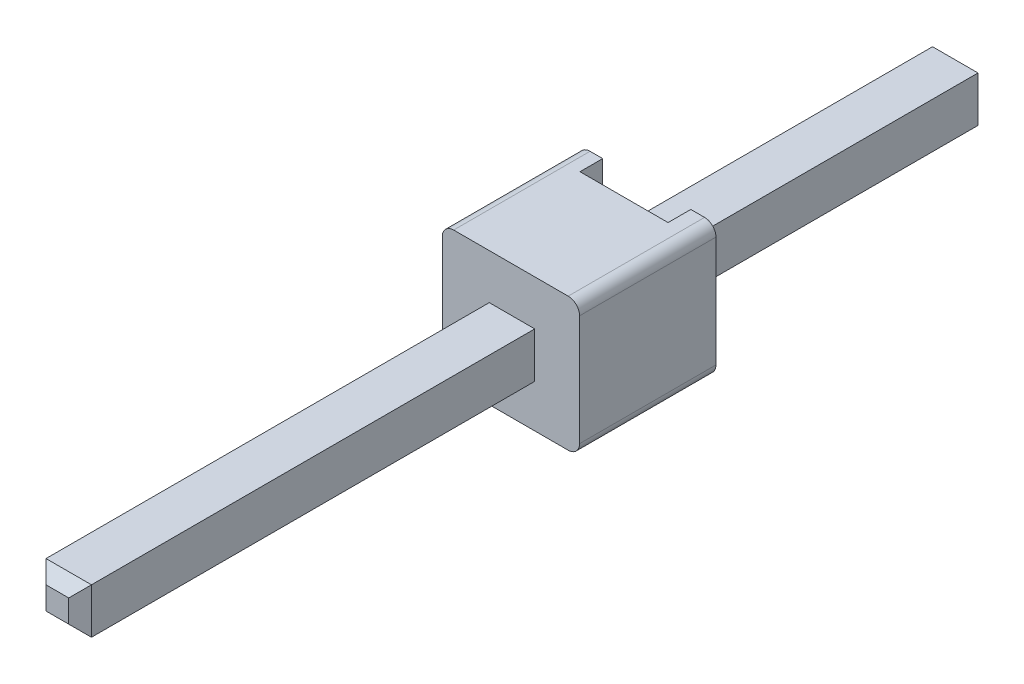
ISO-10303-21;
HEADER;
FILE_DESCRIPTION(('STEP AP214'),'2;1');
FILE_NAME('part.step','',(''),(''),'','','');
FILE_SCHEMA(('AUTOMOTIVE_DESIGN { 1 0 10303 214 1 1 1 1 }'));
ENDSEC;
DATA;
#1=APPLICATION_CONTEXT('core data for automotive mechanical design processes');
#2=APPLICATION_PROTOCOL_DEFINITION('international standard','automotive_design',2000,#1);
#3=PRODUCT_CONTEXT('',#1,'mechanical');
#4=PRODUCT('Part','Part','',(#3));
#5=PRODUCT_RELATED_PRODUCT_CATEGORY('part','',(#4));
#6=PRODUCT_DEFINITION_FORMATION('','',#4);
#7=PRODUCT_DEFINITION_CONTEXT('part definition',#1,'design');
#8=PRODUCT_DEFINITION('design','',#6,#7);
#9=PRODUCT_DEFINITION_SHAPE('','',#8);
#10=(LENGTH_UNIT() NAMED_UNIT(*) SI_UNIT(.MILLI.,.METRE.));
#11=(NAMED_UNIT(*) PLANE_ANGLE_UNIT() SI_UNIT($,.RADIAN.));
#12=(NAMED_UNIT(*) SI_UNIT($,.STERADIAN.) SOLID_ANGLE_UNIT());
#13=UNCERTAINTY_MEASURE_WITH_UNIT(LENGTH_MEASURE(1.E-05),#10,'distance_accuracy_value','');
#14=(GEOMETRIC_REPRESENTATION_CONTEXT(3) GLOBAL_UNCERTAINTY_ASSIGNED_CONTEXT((#13)) GLOBAL_UNIT_ASSIGNED_CONTEXT((#10,
#11,#12)) REPRESENTATION_CONTEXT('',''));
#15=CARTESIAN_POINT('',(0.,0.,0.));
#16=DIRECTION('',(0.,0.,1.));
#17=DIRECTION('',(1.,0.,0.));
#18=AXIS2_PLACEMENT_3D('',#15,#16,#17);
#19=CARTESIAN_POINT('',(-0.76890916540441,1.10391198387765,-2.92219321683463));
#20=DIRECTION('',(-1.086368842107E-12,1.,0.));
#21=DIRECTION('',(-1.,-1.08636537266005E-12,-5.20158568995122E-13));
#22=AXIS2_PLACEMENT_3D('',#19,#20,#21);
#23=PLANE('',#22);
#24=DIRECTION('',(-5.20158568995123E-13,0.,1.));
#25=VECTOR('',#24,1.);
#26=CARTESIAN_POINT('',(-0.36890916540441,1.10391198387809,-2.92219321683442));
#27=LINE('',#26,#25);
#28=CARTESIAN_POINT('',(-0.368909165404462,1.10391198387809,-2.82219321683442));
#29=VERTEX_POINT('',#28);
#30=CARTESIAN_POINT('',(-0.368909165408519,1.10391198387809,4.97780678316558));
#31=VERTEX_POINT('',#30);
#32=EDGE_CURVE('E135',#29,#31,#27,.T.);
#33=ORIENTED_EDGE('',*,*,#32,.F.);
#34=DIRECTION('',(-1.,-1.08636537266005E-12,-5.20158568995122E-13));
#35=VECTOR('',#34,1.);
#36=CARTESIAN_POINT('',(-0.768909165404462,1.10391198387765,-2.82219321683463));
#37=LINE('',#36,#35);
#38=CARTESIAN_POINT('',(-0.768909165404462,1.10391198387765,-2.82219321683463));
#39=VERTEX_POINT('',#38);
#40=EDGE_CURVE('E149',#29,#39,#37,.T.);
#41=ORIENTED_EDGE('',*,*,#40,.T.);
#42=DIRECTION('',(-5.20158568995123E-13,0.,1.));
#43=VECTOR('',#42,1.);
#44=CARTESIAN_POINT('',(-0.76890916540441,1.10391198387765,-2.92219321683463));
#45=LINE('',#44,#43);
#46=CARTESIAN_POINT('',(-0.768909165408519,1.10391198387765,4.97780678316537));
#47=VERTEX_POINT('',#46);
#48=EDGE_CURVE('E142',#39,#47,#45,.T.);
#49=ORIENTED_EDGE('',*,*,#48,.T.);
#50=DIRECTION('',(1.,1.08636537266005E-12,5.20158568995122E-13));
#51=VECTOR('',#50,1.);
#52=CARTESIAN_POINT('',(-0.368909165408519,1.10391198387809,4.97780678316558));
#53=LINE('',#52,#51);
#54=EDGE_CURVE('E182',#47,#31,#53,.T.);
#55=ORIENTED_EDGE('',*,*,#54,.T.);
#56=EDGE_LOOP('',(#33,#41,#49,#55));
#57=FACE_BOUND('',#56,.T.);
#58=ADVANCED_FACE('F47',(#57),#23,.T.);
#59=CARTESIAN_POINT('',(-0.36890916540441,1.10391198387809,-2.92219321683442));
#60=DIRECTION('',(1.,1.08663642320317E-12,5.20158568995122E-13));
#61=DIRECTION('',(-1.08663989265012E-12,1.,0.));
#62=AXIS2_PLACEMENT_3D('',#59,#60,#61);
#63=PLANE('',#62);
#64=DIRECTION('',(-5.20158568995123E-13,0.,1.));
#65=VECTOR('',#64,1.);
#66=CARTESIAN_POINT('',(-0.368909165403975,0.703911983878085,-2.92219321683442));
#67=LINE('',#66,#65);
#68=CARTESIAN_POINT('',(-0.368909165404027,0.703911983878085,-2.82219321683442));
#69=VERTEX_POINT('',#68);
#70=CARTESIAN_POINT('',(-0.368909165408084,0.703911983878085,4.97780678316558));
#71=VERTEX_POINT('',#70);
#72=EDGE_CURVE('E194',#69,#71,#67,.T.);
#73=ORIENTED_EDGE('',*,*,#72,.F.);
#74=DIRECTION('',(-1.08663989265012E-12,1.,0.));
#75=VECTOR('',#74,1.);
#76=CARTESIAN_POINT('',(-0.368909165404462,1.10391198387809,-2.82219321683442));
#77=LINE('',#76,#75);
#78=EDGE_CURVE('E12',#69,#29,#77,.T.);
#79=ORIENTED_EDGE('',*,*,#78,.T.);
#80=ORIENTED_EDGE('',*,*,#32,.T.);
#81=DIRECTION('',(1.08663989265012E-12,-1.,0.));
#82=VECTOR('',#81,1.);
#83=CARTESIAN_POINT('',(-0.368909165408084,0.703911983878085,4.97780678316558));
#84=LINE('',#83,#82);
#85=EDGE_CURVE('E153',#31,#71,#84,.T.);
#86=ORIENTED_EDGE('',*,*,#85,.T.);
#87=EDGE_LOOP('',(#73,#79,#80,#86));
#88=FACE_BOUND('',#87,.T.);
#89=ADVANCED_FACE('F198',(#88),#63,.T.);
#90=CARTESIAN_POINT('',(-0.768909165403975,0.703911983877651,-2.92219321683463));
#91=DIRECTION('',(1.086368842107E-12,-1.,0.));
#92=DIRECTION('',(1.,1.08636537266005E-12,5.20158568995122E-13));
#93=AXIS2_PLACEMENT_3D('',#90,#91,#92);
#94=PLANE('',#93);
#95=DIRECTION('',(-5.20158568995123E-13,0.,1.));
#96=VECTOR('',#95,1.);
#97=CARTESIAN_POINT('',(-0.768909165403975,0.703911983877651,-2.92219321683463));
#98=LINE('',#97,#96);
#99=CARTESIAN_POINT('',(-0.768909165404027,0.703911983877651,-2.82219321683463));
#100=VERTEX_POINT('',#99);
#101=CARTESIAN_POINT('',(-0.768909165408085,0.703911983877651,4.97780678316537));
#102=VERTEX_POINT('',#101);
#103=EDGE_CURVE('E192',#100,#102,#98,.T.);
#104=ORIENTED_EDGE('',*,*,#103,.F.);
#105=DIRECTION('',(1.,1.08636537266005E-12,5.20158568995122E-13));
#106=VECTOR('',#105,1.);
#107=CARTESIAN_POINT('',(-0.768909165404027,0.703911983877651,-2.82219321683463));
#108=LINE('',#107,#106);
#109=EDGE_CURVE('E57',#100,#69,#108,.T.);
#110=ORIENTED_EDGE('',*,*,#109,.T.);
#111=ORIENTED_EDGE('',*,*,#72,.T.);
#112=DIRECTION('',(-1.,-1.08636537266005E-12,-5.20158568995122E-13));
#113=VECTOR('',#112,1.);
#114=CARTESIAN_POINT('',(-0.768909165408085,0.703911983877651,4.97780678316537));
#115=LINE('',#114,#113);
#116=EDGE_CURVE('E139',#71,#102,#115,.T.);
#117=ORIENTED_EDGE('',*,*,#116,.T.);
#118=EDGE_LOOP('',(#104,#110,#111,#117));
#119=FACE_BOUND('',#118,.T.);
#120=ADVANCED_FACE('F221',(#119),#94,.T.);
#121=CARTESIAN_POINT('',(-0.76890916540441,1.10391198387765,-2.92219321683463));
#122=DIRECTION('',(-1.,-1.08636537266005E-12,-5.20158568995122E-13));
#123=DIRECTION('',(1.086368842107E-12,-1.,0.));
#124=AXIS2_PLACEMENT_3D('',#121,#122,#123);
#125=PLANE('',#124);
#126=ORIENTED_EDGE('',*,*,#48,.F.);
#127=DIRECTION('',(1.086368842107E-12,-1.,0.));
#128=VECTOR('',#127,1.);
#129=CARTESIAN_POINT('',(-0.768909165404462,1.10391198387765,-2.82219321683463));
#130=LINE('',#129,#128);
#131=EDGE_CURVE('E72',#39,#100,#130,.T.);
#132=ORIENTED_EDGE('',*,*,#131,.T.);
#133=ORIENTED_EDGE('',*,*,#103,.T.);
#134=DIRECTION('',(-1.086368842107E-12,1.,0.));
#135=VECTOR('',#134,1.);
#136=CARTESIAN_POINT('',(-0.768909165408519,1.10391198387765,4.97780678316537));
#137=LINE('',#136,#135);
#138=EDGE_CURVE('E186',#102,#47,#137,.T.);
#139=ORIENTED_EDGE('',*,*,#138,.T.);
#140=EDGE_LOOP('',(#126,#132,#133,#139));
#141=FACE_BOUND('',#140,.T.);
#142=ADVANCED_FACE('F224',(#141),#125,.T.);
#143=CARTESIAN_POINT('',(0.204151582397016,0.343664424067957,-2.92219321683412));
#144=DIRECTION('',(5.20158568995123E-13,0.,-1.));
#145=DIRECTION('',(1.,1.08636537266005E-12,5.20158568995122E-13));
#146=AXIS2_PLACEMENT_3D('',#143,#144,#145);
#147=PLANE('',#146);
#148=DIRECTION('',(-1.086368842107E-12,1.,0.));
#149=VECTOR('',#148,1.);
#150=CARTESIAN_POINT('',(-0.668909165403584,0.343664424067009,-2.92219321683457));
#151=LINE('',#150,#149);
#152=CARTESIAN_POINT('',(-0.668909165404084,0.803911983877759,-2.92219321683457));
#153=VERTEX_POINT('',#152);
#154=CARTESIAN_POINT('',(-0.668909165404301,1.00391198387776,-2.92219321683457));
#155=VERTEX_POINT('',#154);
#156=EDGE_CURVE('E157',#153,#155,#151,.T.);
#157=ORIENTED_EDGE('',*,*,#156,.T.);
#158=DIRECTION('',(1.,1.08636537266005E-12,5.20158568995122E-13));
#159=VECTOR('',#158,1.);
#160=CARTESIAN_POINT('',(0.204151582396299,1.00391198387871,-2.92219321683412));
#161=LINE('',#160,#159);
#162=CARTESIAN_POINT('',(-0.468909165404301,1.00391198387798,-2.92219321683447));
#163=VERTEX_POINT('',#162);
#164=EDGE_CURVE('E159',#155,#163,#161,.T.);
#165=ORIENTED_EDGE('',*,*,#164,.T.);
#166=DIRECTION('',(1.08663989265012E-12,-1.,0.));
#167=VECTOR('',#166,1.);
#168=CARTESIAN_POINT('',(-0.468909165403584,0.343664424067226,-2.92219321683447));
#169=LINE('',#168,#167);
#170=CARTESIAN_POINT('',(-0.468909165404084,0.803911983877977,-2.92219321683447));
#171=VERTEX_POINT('',#170);
#172=EDGE_CURVE('E152',#163,#171,#169,.T.);
#173=ORIENTED_EDGE('',*,*,#172,.T.);
#174=DIRECTION('',(-1.,-1.08636537266005E-12,-5.20158568995122E-13));
#175=VECTOR('',#174,1.);
#176=CARTESIAN_POINT('',(0.204151582396516,0.803911983878708,-2.92219321683412));
#177=LINE('',#176,#175);
#178=EDGE_CURVE('E155',#171,#153,#177,.T.);
#179=ORIENTED_EDGE('',*,*,#178,.T.);
#180=EDGE_LOOP('',(#157,#165,#173,#179));
#181=FACE_BOUND('',#180,.T.);
#182=ADVANCED_FACE('F227',(#181),#147,.T.);
#183=CARTESIAN_POINT('',(0.204151582392855,0.343664424067957,5.07780678316588));
#184=DIRECTION('',(5.20158568995123E-13,0.,-1.));
#185=DIRECTION('',(1.,1.08636537266005E-12,5.20158568995122E-13));
#186=AXIS2_PLACEMENT_3D('',#183,#184,#185);
#187=PLANE('',#186);
#188=DIRECTION('',(-1.,-1.08636537266005E-12,-5.20158568995122E-13));
#189=VECTOR('',#188,1.);
#190=CARTESIAN_POINT('',(-0.768909165408463,1.00391198387765,5.07780678316537));
#191=LINE('',#190,#189);
#192=CARTESIAN_POINT('',(-0.468909165408464,1.00391198387797,5.07780678316553));
#193=VERTEX_POINT('',#192);
#194=CARTESIAN_POINT('',(-0.668909165408461,1.00391198387776,5.07780678316542));
#195=VERTEX_POINT('',#194);
#196=EDGE_CURVE('E124',#193,#195,#191,.T.);
#197=ORIENTED_EDGE('',*,*,#196,.T.);
#198=DIRECTION('',(1.086368842107E-12,-1.,0.));
#199=VECTOR('',#198,1.);
#200=CARTESIAN_POINT('',(-0.668909165408135,0.703911983877759,5.07780678316542));
#201=LINE('',#200,#199);
#202=CARTESIAN_POINT('',(-0.668909165408243,0.803911983877761,5.07780678316542));
#203=VERTEX_POINT('',#202);
#204=EDGE_CURVE('E120',#195,#203,#201,.T.);
#205=ORIENTED_EDGE('',*,*,#204,.T.);
#206=DIRECTION('',(1.,1.08636537266005E-12,5.20158568995122E-13));
#207=VECTOR('',#206,1.);
#208=CARTESIAN_POINT('',(-0.368909165408245,0.803911983878087,5.07780678316558));
#209=LINE('',#208,#207);
#210=CARTESIAN_POINT('',(-0.468909165408247,0.803911983877978,5.07780678316553));
#211=VERTEX_POINT('',#210);
#212=EDGE_CURVE('E114',#203,#211,#209,.T.);
#213=ORIENTED_EDGE('',*,*,#212,.T.);
#214=DIRECTION('',(-1.08663989265012E-12,1.,0.));
#215=VECTOR('',#214,1.);
#216=CARTESIAN_POINT('',(-0.468909165408573,1.10391198387798,5.07780678316553));
#217=LINE('',#216,#215);
#218=EDGE_CURVE('E117',#211,#193,#217,.T.);
#219=ORIENTED_EDGE('',*,*,#218,.T.);
#220=EDGE_LOOP('',(#197,#205,#213,#219));
#221=FACE_BOUND('',#220,.T.);
#222=ADVANCED_FACE('F116',(#221),#187,.F.);
#223=CARTESIAN_POINT('',(-0.468909165407747,0.343664424067226,5.07780678316553));
#224=DIRECTION('',(0.707106781186177,7.68367983530853E-13,0.707106781186918));
#225=DIRECTION('',(1.08663989265012E-12,-1.,0.));
#226=AXIS2_PLACEMENT_3D('',#223,#224,#225);
#227=PLANE('',#226);
#228=DIRECTION('',(0.577350269190555,-0.577350269189,-0.577350269189322));
#229=VECTOR('',#228,1.);
#230=CARTESIAN_POINT('',(-0.315493312137749,0.650496130607893,4.92439092989536));
#231=LINE('',#230,#229);
#232=EDGE_CURVE('E130',#71,#211,#231,.F.);
#233=ORIENTED_EDGE('',*,*,#232,.F.);
#234=ORIENTED_EDGE('',*,*,#85,.F.);
#235=DIRECTION('',(-0.5773502691893,-0.577350269190255,0.577350269189322));
#236=VECTOR('',#235,1.);
#237=CARTESIAN_POINT('',(-0.688991685345257,0.783829463940818,5.29788930310233));
#238=LINE('',#237,#236);
#239=EDGE_CURVE('E133',#193,#31,#238,.F.);
#240=ORIENTED_EDGE('',*,*,#239,.F.);
#241=ORIENTED_EDGE('',*,*,#218,.F.);
#242=EDGE_LOOP('',(#233,#234,#240,#241));
#243=FACE_BOUND('',#242,.T.);
#244=ADVANCED_FACE('F128',(#243),#227,.T.);
#245=CARTESIAN_POINT('',(0.204151582392137,1.00391198387871,5.07780678316588));
#246=DIRECTION('',(-1.13598642655238E-12,0.707106781186545,0.70710678118655));
#247=DIRECTION('',(1.,1.08636537266005E-12,5.20158568995122E-13));
#248=AXIS2_PLACEMENT_3D('',#245,#246,#247);
#249=PLANE('',#248);
#250=ORIENTED_EDGE('',*,*,#239,.T.);
#251=ORIENTED_EDGE('',*,*,#54,.F.);
#252=DIRECTION('',(0.577350269189954,-0.577350269189,0.577350269189923));
#253=VECTOR('',#252,1.);
#254=CARTESIAN_POINT('',(-0.377888916141428,0.712891734611206,5.36882703243244));
#255=LINE('',#254,#253);
#256=EDGE_CURVE('E140',#195,#47,#255,.F.);
#257=ORIENTED_EDGE('',*,*,#256,.F.);
#258=ORIENTED_EDGE('',*,*,#196,.F.);
#259=EDGE_LOOP('',(#250,#251,#257,#258));
#260=FACE_BOUND('',#259,.T.);
#261=ADVANCED_FACE('F204',(#260),#249,.T.);
#262=CARTESIAN_POINT('',(0.204151582392355,0.80391198387871,5.07780678316588));
#263=DIRECTION('',(4.0037112369489E-13,-0.707106781186545,0.70710678118655));
#264=DIRECTION('',(-1.,-1.08636537266005E-12,-5.20158568995122E-13));
#265=AXIS2_PLACEMENT_3D('',#262,#263,#264);
#266=PLANE('',#265);
#267=ORIENTED_EDGE('',*,*,#232,.T.);
#268=ORIENTED_EDGE('',*,*,#212,.F.);
#269=DIRECTION('',(-0.5773502691887,-0.577350269190255,-0.577350269189923));
#270=VECTOR('',#269,1.);
#271=CARTESIAN_POINT('',(-0.377888916141843,1.09493223314495,5.36882703243244));
#272=LINE('',#271,#270);
#273=EDGE_CURVE('E145',#102,#203,#272,.F.);
#274=ORIENTED_EDGE('',*,*,#273,.F.);
#275=ORIENTED_EDGE('',*,*,#116,.F.);
#276=EDGE_LOOP('',(#267,#268,#274,#275));
#277=FACE_BOUND('',#276,.T.);
#278=ADVANCED_FACE('F137',(#277),#266,.T.);
#279=CARTESIAN_POINT('',(-0.668909165407743,0.343664424067009,5.07780678316542));
#280=DIRECTION('',(-0.707106781186912,-7.68176321854567E-13,0.707106781186183));
#281=DIRECTION('',(-1.086368842107E-12,1.,0.));
#282=AXIS2_PLACEMENT_3D('',#279,#280,#281);
#283=PLANE('',#282);
#284=ORIENTED_EDGE('',*,*,#256,.T.);
#285=ORIENTED_EDGE('',*,*,#138,.F.);
#286=ORIENTED_EDGE('',*,*,#273,.T.);
#287=ORIENTED_EDGE('',*,*,#204,.F.);
#288=EDGE_LOOP('',(#284,#285,#286,#287));
#289=FACE_BOUND('',#288,.T.);
#290=ADVANCED_FACE('F205',(#289),#283,.T.);
#291=CARTESIAN_POINT('',(-0.768909165404027,0.703911983877651,-2.82219321683463));
#292=DIRECTION('',(-1.13598642655238E-12,0.707106781186545,0.70710678118655));
#293=DIRECTION('',(1.,1.08636537266005E-12,5.20158568995122E-13));
#294=AXIS2_PLACEMENT_3D('',#291,#292,#293);
#295=PLANE('',#294);
#296=DIRECTION('',(0.577350269189301,0.577350269190255,-0.577350269189322));
#297=VECTOR('',#296,1.);
#298=CARTESIAN_POINT('',(-0.768909165404027,0.703911983877651,-2.82219321683463));
#299=LINE('',#298,#297);
#300=EDGE_CURVE('E167',#153,#100,#299,.F.);
#301=ORIENTED_EDGE('',*,*,#300,.F.);
#302=ORIENTED_EDGE('',*,*,#178,.F.);
#303=DIRECTION('',(-0.577350269189954,0.577350269189,-0.577350269189923));
#304=VECTOR('',#303,1.);
#305=CARTESIAN_POINT('',(-0.502242498737437,0.837245317211274,-2.95552655016782));
#306=LINE('',#305,#304);
#307=EDGE_CURVE('E52',#69,#171,#306,.T.);
#308=ORIENTED_EDGE('',*,*,#307,.F.);
#309=ORIENTED_EDGE('',*,*,#109,.F.);
#310=EDGE_LOOP('',(#301,#302,#308,#309));
#311=FACE_BOUND('',#310,.T.);
#312=ADVANCED_FACE('F50',(#311),#295,.F.);
#313=CARTESIAN_POINT('',(-0.368909165404462,1.10391198387809,-2.82219321683442));
#314=DIRECTION('',(-0.707106781186913,-7.68367983531653E-13,0.707106781186182));
#315=DIRECTION('',(-1.08663989265012E-12,1.,0.));
#316=AXIS2_PLACEMENT_3D('',#313,#314,#315);
#317=PLANE('',#316);
#318=ORIENTED_EDGE('',*,*,#307,.T.);
#319=ORIENTED_EDGE('',*,*,#172,.F.);
#320=DIRECTION('',(0.577350269188699,0.577350269190255,0.577350269189923));
#321=VECTOR('',#320,1.);
#322=CARTESIAN_POINT('',(-0.368909165404462,1.10391198387809,-2.82219321683442));
#323=LINE('',#322,#321);
#324=EDGE_CURVE('E166',#29,#163,#323,.F.);
#325=ORIENTED_EDGE('',*,*,#324,.F.);
#326=ORIENTED_EDGE('',*,*,#78,.F.);
#327=EDGE_LOOP('',(#318,#319,#325,#326));
#328=FACE_BOUND('',#327,.T.);
#329=ADVANCED_FACE('F212',(#328),#317,.F.);
#330=CARTESIAN_POINT('',(-0.768909165404462,1.10391198387765,-2.82219321683463));
#331=DIRECTION('',(0.707106781186177,7.68176321853768E-13,0.707106781186918));
#332=DIRECTION('',(1.086368842107E-12,-1.,0.));
#333=AXIS2_PLACEMENT_3D('',#330,#331,#332);
#334=PLANE('',#333);
#335=ORIENTED_EDGE('',*,*,#300,.T.);
#336=ORIENTED_EDGE('',*,*,#131,.F.);
#337=DIRECTION('',(0.577350269190555,-0.577350269189,-0.577350269189322));
#338=VECTOR('',#337,1.);
#339=CARTESIAN_POINT('',(-0.768909165404462,1.10391198387765,-2.82219321683463));
#340=LINE('',#339,#338);
#341=EDGE_CURVE('E164',#155,#39,#340,.F.);
#342=ORIENTED_EDGE('',*,*,#341,.F.);
#343=ORIENTED_EDGE('',*,*,#156,.F.);
#344=EDGE_LOOP('',(#335,#336,#342,#343));
#345=FACE_BOUND('',#344,.T.);
#346=ADVANCED_FACE('F254',(#345),#334,.F.);
#347=CARTESIAN_POINT('',(-0.768909165404462,1.10391198387765,-2.82219321683463));
#348=DIRECTION('',(4.0037112369489E-13,-0.707106781186545,0.70710678118655));
#349=DIRECTION('',(-1.,-1.08636537266005E-12,-5.20158568995122E-13));
#350=AXIS2_PLACEMENT_3D('',#347,#348,#349);
#351=PLANE('',#350);
#352=ORIENTED_EDGE('',*,*,#324,.T.);
#353=ORIENTED_EDGE('',*,*,#164,.F.);
#354=ORIENTED_EDGE('',*,*,#341,.T.);
#355=ORIENTED_EDGE('',*,*,#40,.F.);
#356=EDGE_LOOP('',(#352,#353,#354,#355));
#357=FACE_BOUND('',#356,.T.);
#358=ADVANCED_FACE('F248',(#357),#351,.F.);
#359=CLOSED_SHELL('',(#58,#89,#120,#142,#182,#222,#244,#261,#278,#290,#312,#329,#346,#358));
#360=MANIFOLD_SOLID_BREP('B2',#359);
#361=CARTESIAN_POINT('',(0.20415158239556,0.326344799229834,-0.122193216834121));
#362=DIRECTION('',(5.20158568995123E-13,0.,-1.));
#363=DIRECTION('',(1.,1.08636537266005E-12,5.20158568995122E-13));
#364=AXIS2_PLACEMENT_3D('',#361,#362,#363);
#365=PLANE('',#364);
#366=DIRECTION('',(-1.086368842107E-12,1.,0.));
#367=VECTOR('',#366,1.);
#368=CARTESIAN_POINT('',(-0.970848417604441,0.326344799228557,-0.122193216834732));
#369=LINE('',#368,#367);
#370=CARTESIAN_POINT('',(-0.970848417604441,0.326344799228557,-0.122193216834732));
#371=VERTEX_POINT('',#370);
#372=CARTESIAN_POINT('',(-0.970848417605716,1.50047048269109,-0.122193216834732));
#373=VERTEX_POINT('',#372);
#374=EDGE_CURVE('E363',#371,#373,#369,.T.);
#375=ORIENTED_EDGE('',*,*,#374,.F.);
#376=DIRECTION('',(1.,1.08636537266005E-12,5.20158568995122E-13));
#377=VECTOR('',#376,1.);
#378=CARTESIAN_POINT('',(0.0253863076322072,0.326344799229639,-0.122193216834213));
#379=LINE('',#378,#377);
#380=CARTESIAN_POINT('',(-1.08218877990179,0.326344799228436,-0.12219321683479));
#381=VERTEX_POINT('',#380);
#382=EDGE_CURVE('E461',#381,#371,#379,.T.);
#383=ORIENTED_EDGE('',*,*,#382,.F.);
#384=CARTESIAN_POINT('',(-1.0821887799019,0.426344799228436,-0.12219321683479));
#385=DIRECTION('',(5.20158568995123E-13,0.,-1.));
#386=DIRECTION('',(1.,1.08636537266005E-12,5.20158568995122E-13));
#387=AXIS2_PLACEMENT_3D('',#384,#385,#386);
#388=CIRCLE('',#387,0.1);
#389=CARTESIAN_POINT('',(-1.1821887799019,0.426344799228328,-0.122193216834842));
#390=VERTEX_POINT('',#389);
#391=EDGE_CURVE('E491',#381,#390,#388,.T.);
#392=ORIENTED_EDGE('',*,*,#391,.T.);
#393=DIRECTION('',(1.08673820705242E-12,-1.,0.));
#394=VECTOR('',#393,1.);
#395=CARTESIAN_POINT('',(-1.18218877990179,0.326344799228328,-0.122193216834842));
#396=LINE('',#395,#394);
#397=CARTESIAN_POINT('',(-1.18218877990296,1.40047048269086,-0.122193216834842));
#398=VERTEX_POINT('',#397);
#399=EDGE_CURVE('E482',#398,#390,#396,.T.);
#400=ORIENTED_EDGE('',*,*,#399,.F.);
#401=CARTESIAN_POINT('',(-1.08218877990296,1.40047048269097,-0.12219321683479));
#402=DIRECTION('',(5.20158568995123E-13,0.,-1.));
#403=DIRECTION('',(1.,1.08636537266005E-12,5.20158568995122E-13));
#404=AXIS2_PLACEMENT_3D('',#401,#402,#403);
#405=CIRCLE('',#404,0.1);
#406=CARTESIAN_POINT('',(-1.08218877990306,1.50047048269097,-0.12219321683479));
#407=VERTEX_POINT('',#406);
#408=EDGE_CURVE('E498',#398,#407,#405,.T.);
#409=ORIENTED_EDGE('',*,*,#408,.T.);
#410=DIRECTION('',(-1.,-1.08636537266005E-12,-5.20158568995122E-13));
#411=VECTOR('',#410,1.);
#412=CARTESIAN_POINT('',(0.0253863076309317,1.50047048269217,-0.122193216834213));
#413=LINE('',#412,#411);
#414=EDGE_CURVE('E463',#373,#407,#413,.T.);
#415=ORIENTED_EDGE('',*,*,#414,.F.);
#416=EDGE_LOOP('',(#375,#383,#392,#400,#409,#415));
#417=FACE_BOUND('',#416,.T.);
#418=ADVANCED_FACE('F355',(#417),#365,.T.);
#419=CARTESIAN_POINT('',(0.025386307631583,0.326344799229639,1.07780678316579));
#420=DIRECTION('',(-1.086368842107E-12,1.,0.));
#421=DIRECTION('',(-1.,-1.08636537266005E-12,-5.20158568995122E-13));
#422=AXIS2_PLACEMENT_3D('',#419,#420,#421);
#423=PLANE('',#422);
#424=ORIENTED_EDGE('',*,*,#382,.T.);
#425=DIRECTION('',(5.20158568995123E-13,0.,-1.));
#426=VECTOR('',#425,1.);
#427=CARTESIAN_POINT('',(-0.970848417604441,0.326344799228557,-0.122193216834732));
#428=LINE('',#427,#426);
#429=CARTESIAN_POINT('',(-0.970848417604545,0.326344799228557,0.0778067831652683));
#430=VERTEX_POINT('',#429);
#431=EDGE_CURVE('E446',#430,#371,#428,.T.);
#432=ORIENTED_EDGE('',*,*,#431,.F.);
#433=DIRECTION('',(-1.,-1.08636537266005E-12,-5.20158568995122E-13));
#434=VECTOR('',#433,1.);
#435=CARTESIAN_POINT('',(-0.970848417604545,0.326344799228557,0.0778067831652683));
#436=LINE('',#435,#434);
#437=CARTESIAN_POINT('',(-0.195848417604544,0.326344799229399,0.0778067831656714));
#438=VERTEX_POINT('',#437);
#439=EDGE_CURVE('E526',#438,#430,#436,.T.);
#440=ORIENTED_EDGE('',*,*,#439,.F.);
#441=DIRECTION('',(-5.20158568995123E-13,0.,1.));
#442=VECTOR('',#441,1.);
#443=CARTESIAN_POINT('',(-0.19584841760444,0.326344799229399,-0.122193216834329));
#444=LINE('',#443,#442);
#445=CARTESIAN_POINT('',(-0.19584841760444,0.326344799229399,-0.122193216834329));
#446=VERTEX_POINT('',#445);
#447=EDGE_CURVE('E456',#446,#438,#444,.T.);
#448=ORIENTED_EDGE('',*,*,#447,.F.);
#449=CARTESIAN_POINT('',(-0.0746136923677928,0.326344799229531,-0.122193216834266));
#450=VERTEX_POINT('',#449);
#451=EDGE_CURVE('E471',#446,#450,#379,.T.);
#452=ORIENTED_EDGE('',*,*,#451,.T.);
#453=DIRECTION('',(5.20158568995123E-13,0.,-1.));
#454=VECTOR('',#453,1.);
#455=CARTESIAN_POINT('',(-0.0746136923684169,0.326344799229531,1.07780678316573));
#456=LINE('',#455,#454);
#457=CARTESIAN_POINT('',(-0.0746136923684169,0.326344799229531,1.07780678316573));
#458=VERTEX_POINT('',#457);
#459=EDGE_CURVE('E518',#450,#458,#456,.F.);
#460=ORIENTED_EDGE('',*,*,#459,.T.);
#461=DIRECTION('',(1.,1.08636537266005E-12,5.20158568995122E-13));
#462=VECTOR('',#461,1.);
#463=CARTESIAN_POINT('',(0.025386307631583,0.326344799229639,1.07780678316579));
#464=LINE('',#463,#462);
#465=CARTESIAN_POINT('',(-1.08218877990241,0.326344799228436,1.07780678316521));
#466=VERTEX_POINT('',#465);
#467=EDGE_CURVE('E485',#466,#458,#464,.T.);
#468=ORIENTED_EDGE('',*,*,#467,.F.);
#469=DIRECTION('',(5.20158568995123E-13,0.,-1.));
#470=VECTOR('',#469,1.);
#471=CARTESIAN_POINT('',(-1.08218877990241,0.326344799228436,1.07780678316521));
#472=LINE('',#471,#470);
#473=EDGE_CURVE('E469',#466,#381,#472,.T.);
#474=ORIENTED_EDGE('',*,*,#473,.T.);
#475=EDGE_LOOP('',(#424,#432,#440,#448,#452,#460,#468,#474));
#476=FACE_BOUND('',#475,.T.);
#477=ADVANCED_FACE('F466',(#476),#423,.F.);
#478=CARTESIAN_POINT('',(0.025386307631583,0.326344799229639,1.07780678316579));
#479=DIRECTION('',(-1.,-1.08636537266005E-12,-5.20158568995122E-13));
#480=DIRECTION('',(1.086368842107E-12,-1.,0.));
#481=AXIS2_PLACEMENT_3D('',#478,#479,#480);
#482=PLANE('',#481);
#483=DIRECTION('',(-1.086368842107E-12,1.,0.));
#484=VECTOR('',#483,1.);
#485=CARTESIAN_POINT('',(0.0253863076322072,0.326344799229639,-0.122193216834213));
#486=LINE('',#485,#484);
#487=CARTESIAN_POINT('',(0.0253863076320986,0.426344799229639,-0.122193216834213));
#488=VERTEX_POINT('',#487);
#489=CARTESIAN_POINT('',(0.0253863076310403,1.40047048269217,-0.122193216834213));
#490=VERTEX_POINT('',#489);
#491=EDGE_CURVE('E470',#488,#490,#486,.T.);
#492=ORIENTED_EDGE('',*,*,#491,.T.);
#493=DIRECTION('',(5.20158568995123E-13,0.,-1.));
#494=VECTOR('',#493,1.);
#495=CARTESIAN_POINT('',(0.0253863076304161,1.40047048269217,1.07780678316579));
#496=LINE('',#495,#494);
#497=CARTESIAN_POINT('',(0.0253863076304161,1.40047048269217,1.07780678316579));
#498=VERTEX_POINT('',#497);
#499=EDGE_CURVE('E378',#490,#498,#496,.F.);
#500=ORIENTED_EDGE('',*,*,#499,.T.);
#501=DIRECTION('',(-1.086368842107E-12,1.,0.));
#502=VECTOR('',#501,1.);
#503=CARTESIAN_POINT('',(0.025386307631583,0.326344799229639,1.07780678316579));
#504=LINE('',#503,#502);
#505=CARTESIAN_POINT('',(0.0253863076314744,0.426344799229639,1.07780678316579));
#506=VERTEX_POINT('',#505);
#507=EDGE_CURVE('E541',#506,#498,#504,.T.);
#508=ORIENTED_EDGE('',*,*,#507,.F.);
#509=DIRECTION('',(5.20158568995123E-13,0.,-1.));
#510=VECTOR('',#509,1.);
#511=CARTESIAN_POINT('',(0.0253863076314744,0.426344799229639,1.07780678316579));
#512=LINE('',#511,#510);
#513=EDGE_CURVE('E513',#506,#488,#512,.T.);
#514=ORIENTED_EDGE('',*,*,#513,.T.);
#515=EDGE_LOOP('',(#492,#500,#508,#514));
#516=FACE_BOUND('',#515,.T.);
#517=ADVANCED_FACE('F581',(#516),#482,.F.);
#518=CARTESIAN_POINT('',(0.0253863076303075,1.50047048269217,1.07780678316579));
#519=DIRECTION('',(1.086368842107E-12,-1.,0.));
#520=DIRECTION('',(1.,1.08636537266005E-12,5.20158568995122E-13));
#521=AXIS2_PLACEMENT_3D('',#518,#519,#520);
#522=PLANE('',#521);
#523=DIRECTION('',(-1.,-1.08636537266005E-12,-5.20158568995122E-13));
#524=VECTOR('',#523,1.);
#525=CARTESIAN_POINT('',(0.0253863076308276,1.50047048269217,0.0778067831657866));
#526=LINE('',#525,#524);
#527=CARTESIAN_POINT('',(-0.19584841760582,1.50047048269193,0.0778067831656714));
#528=VERTEX_POINT('',#527);
#529=CARTESIAN_POINT('',(-0.97084841760582,1.50047048269109,0.0778067831652683));
#530=VERTEX_POINT('',#529);
#531=EDGE_CURVE('E45',#528,#530,#526,.T.);
#532=ORIENTED_EDGE('',*,*,#531,.T.);
#533=DIRECTION('',(5.20158568995123E-13,0.,-1.));
#534=VECTOR('',#533,1.);
#535=CARTESIAN_POINT('',(-0.97084841760634,1.50047048269109,1.07780678316527));
#536=LINE('',#535,#534);
#537=EDGE_CURVE('E474',#530,#373,#536,.T.);
#538=ORIENTED_EDGE('',*,*,#537,.T.);
#539=ORIENTED_EDGE('',*,*,#414,.T.);
#540=DIRECTION('',(5.20158568995123E-13,0.,-1.));
#541=VECTOR('',#540,1.);
#542=CARTESIAN_POINT('',(-1.08218877990369,1.50047048269097,1.07780678316521));
#543=LINE('',#542,#541);
#544=CARTESIAN_POINT('',(-1.08218877990369,1.50047048269097,1.07780678316521));
#545=VERTEX_POINT('',#544);
#546=EDGE_CURVE('E503',#407,#545,#543,.F.);
#547=ORIENTED_EDGE('',*,*,#546,.T.);
#548=DIRECTION('',(-1.,-1.08636537266005E-12,-5.20158568995122E-13));
#549=VECTOR('',#548,1.);
#550=CARTESIAN_POINT('',(0.0253863076303075,1.50047048269217,1.07780678316579));
#551=LINE('',#550,#549);
#552=CARTESIAN_POINT('',(-0.0746136923696925,1.50047048269207,1.07780678316573));
#553=VERTEX_POINT('',#552);
#554=EDGE_CURVE('E543',#553,#545,#551,.T.);
#555=ORIENTED_EDGE('',*,*,#554,.F.);
#556=DIRECTION('',(5.20158568995123E-13,0.,-1.));
#557=VECTOR('',#556,1.);
#558=CARTESIAN_POINT('',(-0.0746136923696925,1.50047048269207,1.07780678316573));
#559=LINE('',#558,#557);
#560=CARTESIAN_POINT('',(-0.0746136923690683,1.50047048269207,-0.122193216834266));
#561=VERTEX_POINT('',#560);
#562=EDGE_CURVE('E500',#553,#561,#559,.T.);
#563=ORIENTED_EDGE('',*,*,#562,.T.);
#564=CARTESIAN_POINT('',(-0.195848417605716,1.50047048269193,-0.122193216834329));
#565=VERTEX_POINT('',#564);
#566=EDGE_CURVE('E479',#561,#565,#413,.T.);
#567=ORIENTED_EDGE('',*,*,#566,.T.);
#568=DIRECTION('',(-5.20158568995123E-13,0.,1.));
#569=VECTOR('',#568,1.);
#570=CARTESIAN_POINT('',(-0.19584841760634,1.50047048269193,1.07780678316567));
#571=LINE('',#570,#569);
#572=EDGE_CURVE('E370',#565,#528,#571,.T.);
#573=ORIENTED_EDGE('',*,*,#572,.T.);
#574=EDGE_LOOP('',(#532,#538,#539,#547,#555,#563,#567,#573));
#575=FACE_BOUND('',#574,.T.);
#576=ADVANCED_FACE('F560',(#575),#522,.F.);
#577=CARTESIAN_POINT('',(-1.18218877990241,0.326344799228328,1.07780678316516));
#578=DIRECTION('',(1.,1.08673473760547E-12,5.20158568995122E-13));
#579=DIRECTION('',(-1.08673820705242E-12,1.,0.));
#580=AXIS2_PLACEMENT_3D('',#577,#578,#579);
#581=PLANE('',#580);
#582=DIRECTION('',(1.08673820705242E-12,-1.,0.));
#583=VECTOR('',#582,1.);
#584=CARTESIAN_POINT('',(-1.18218877990241,0.326344799228328,1.07780678316516));
#585=LINE('',#584,#583);
#586=CARTESIAN_POINT('',(-1.18218877990358,1.40047048269086,1.07780678316516));
#587=VERTEX_POINT('',#586);
#588=CARTESIAN_POINT('',(-1.18218877990252,0.426344799228328,1.07780678316516));
#589=VERTEX_POINT('',#588);
#590=EDGE_CURVE('E476',#587,#589,#585,.T.);
#591=ORIENTED_EDGE('',*,*,#590,.F.);
#592=DIRECTION('',(5.20158568995123E-13,0.,-1.));
#593=VECTOR('',#592,1.);
#594=CARTESIAN_POINT('',(-1.18218877990358,1.40047048269086,1.07780678316516));
#595=LINE('',#594,#593);
#596=EDGE_CURVE('E488',#587,#398,#595,.T.);
#597=ORIENTED_EDGE('',*,*,#596,.T.);
#598=ORIENTED_EDGE('',*,*,#399,.T.);
#599=DIRECTION('',(5.20158568995123E-13,0.,-1.));
#600=VECTOR('',#599,1.);
#601=CARTESIAN_POINT('',(-1.18218877990252,0.426344799228328,1.07780678316516));
#602=LINE('',#601,#600);
#603=EDGE_CURVE('E486',#390,#589,#602,.F.);
#604=ORIENTED_EDGE('',*,*,#603,.T.);
#605=EDGE_LOOP('',(#591,#597,#598,#604));
#606=FACE_BOUND('',#605,.T.);
#607=ADVANCED_FACE('F555',(#606),#581,.F.);
#608=CARTESIAN_POINT('',(0.204151582394935,0.326344799229834,1.07780678316588));
#609=DIRECTION('',(5.20158568995123E-13,0.,-1.));
#610=DIRECTION('',(1.,1.08636537266005E-12,5.20158568995122E-13));
#611=AXIS2_PLACEMENT_3D('',#608,#609,#610);
#612=PLANE('',#611);
#613=ORIENTED_EDGE('',*,*,#554,.T.);
#614=CARTESIAN_POINT('',(-1.08218877990358,1.40047048269097,1.07780678316521));
#615=DIRECTION('',(5.20158568995123E-13,0.,-1.));
#616=DIRECTION('',(1.,1.08636537266005E-12,5.20158568995122E-13));
#617=AXIS2_PLACEMENT_3D('',#614,#615,#616);
#618=CIRCLE('',#617,0.1);
#619=EDGE_CURVE('E511',#545,#587,#618,.F.);
#620=ORIENTED_EDGE('',*,*,#619,.T.);
#621=ORIENTED_EDGE('',*,*,#590,.T.);
#622=CARTESIAN_POINT('',(-1.08218877990252,0.426344799228436,1.07780678316521));
#623=DIRECTION('',(5.20158568995123E-13,0.,-1.));
#624=DIRECTION('',(1.,1.08636537266005E-12,5.20158568995122E-13));
#625=AXIS2_PLACEMENT_3D('',#622,#623,#624);
#626=CIRCLE('',#625,0.1);
#627=EDGE_CURVE('E505',#589,#466,#626,.F.);
#628=ORIENTED_EDGE('',*,*,#627,.T.);
#629=ORIENTED_EDGE('',*,*,#467,.T.);
#630=CARTESIAN_POINT('',(-0.0746136923685256,0.426344799229531,1.07780678316573));
#631=DIRECTION('',(5.20158568995123E-13,0.,-1.));
#632=DIRECTION('',(1.,1.08636537266005E-12,5.20158568995122E-13));
#633=AXIS2_PLACEMENT_3D('',#630,#631,#632);
#634=CIRCLE('',#633,0.1);
#635=EDGE_CURVE('E507',#458,#506,#634,.F.);
#636=ORIENTED_EDGE('',*,*,#635,.T.);
#637=ORIENTED_EDGE('',*,*,#507,.T.);
#638=CARTESIAN_POINT('',(-0.0746136923695839,1.40047048269207,1.07780678316573));
#639=DIRECTION('',(5.20158568995123E-13,0.,-1.));
#640=DIRECTION('',(1.,1.08636537266005E-12,5.20158568995122E-13));
#641=AXIS2_PLACEMENT_3D('',#638,#639,#640);
#642=CIRCLE('',#641,0.1);
#643=EDGE_CURVE('E509',#498,#553,#642,.F.);
#644=ORIENTED_EDGE('',*,*,#643,.T.);
#645=EDGE_LOOP('',(#613,#620,#621,#628,#629,#636,#637,#644));
#646=FACE_BOUND('',#645,.T.);
#647=ADVANCED_FACE('F538',(#646),#612,.F.);
#648=DIRECTION('',(1.086368842107E-12,-1.,0.));
#649=VECTOR('',#648,1.);
#650=CARTESIAN_POINT('',(-0.19584841760444,0.326344799229399,-0.122193216834329));
#651=LINE('',#650,#649);
#652=EDGE_CURVE('E464',#565,#446,#651,.T.);
#653=ORIENTED_EDGE('',*,*,#652,.F.);
#654=ORIENTED_EDGE('',*,*,#566,.F.);
#655=CARTESIAN_POINT('',(-0.0746136923689596,1.40047048269207,-0.122193216834266));
#656=DIRECTION('',(5.20158568995123E-13,0.,-1.));
#657=DIRECTION('',(1.,1.08636537266005E-12,5.20158568995122E-13));
#658=AXIS2_PLACEMENT_3D('',#655,#656,#657);
#659=CIRCLE('',#658,0.1);
#660=EDGE_CURVE('E496',#561,#490,#659,.T.);
#661=ORIENTED_EDGE('',*,*,#660,.T.);
#662=ORIENTED_EDGE('',*,*,#491,.F.);
#663=CARTESIAN_POINT('',(-0.0746136923679014,0.426344799229531,-0.122193216834266));
#664=DIRECTION('',(5.20158568995123E-13,0.,-1.));
#665=DIRECTION('',(1.,1.08636537266005E-12,5.20158568995122E-13));
#666=AXIS2_PLACEMENT_3D('',#663,#664,#665);
#667=CIRCLE('',#666,0.1);
#668=EDGE_CURVE('E493',#488,#450,#667,.T.);
#669=ORIENTED_EDGE('',*,*,#668,.T.);
#670=ORIENTED_EDGE('',*,*,#451,.F.);
#671=EDGE_LOOP('',(#653,#654,#661,#662,#669,#670));
#672=FACE_BOUND('',#671,.T.);
#673=ADVANCED_FACE('F528',(#672),#365,.T.);
#674=CARTESIAN_POINT('',(-1.08218877990358,1.40047048269097,1.07780678316521));
#675=DIRECTION('',(5.20158568995123E-13,0.,-1.));
#676=DIRECTION('',(1.,1.08636537266005E-12,5.20158568995122E-13));
#677=AXIS2_PLACEMENT_3D('',#674,#675,#676);
#678=CYLINDRICAL_SURFACE('',#677,0.1);
#679=ORIENTED_EDGE('',*,*,#619,.F.);
#680=ORIENTED_EDGE('',*,*,#546,.F.);
#681=ORIENTED_EDGE('',*,*,#408,.F.);
#682=ORIENTED_EDGE('',*,*,#596,.F.);
#683=EDGE_LOOP('',(#679,#680,#681,#682));
#684=FACE_BOUND('',#683,.T.);
#685=ADVANCED_FACE('F557',(#684),#678,.T.);
#686=CARTESIAN_POINT('',(-0.0746136923695839,1.40047048269207,1.07780678316573));
#687=DIRECTION('',(5.20158568995123E-13,0.,-1.));
#688=DIRECTION('',(1.,1.08636537266005E-12,5.20158568995122E-13));
#689=AXIS2_PLACEMENT_3D('',#686,#687,#688);
#690=CYLINDRICAL_SURFACE('',#689,0.1);
#691=ORIENTED_EDGE('',*,*,#643,.F.);
#692=ORIENTED_EDGE('',*,*,#499,.F.);
#693=ORIENTED_EDGE('',*,*,#660,.F.);
#694=ORIENTED_EDGE('',*,*,#562,.F.);
#695=EDGE_LOOP('',(#691,#692,#693,#694));
#696=FACE_BOUND('',#695,.T.);
#697=ADVANCED_FACE('F590',(#696),#690,.T.);
#698=CARTESIAN_POINT('',(-0.0746136923685256,0.426344799229531,1.07780678316573));
#699=DIRECTION('',(5.20158568995123E-13,0.,-1.));
#700=DIRECTION('',(1.,1.08636537266005E-12,5.20158568995122E-13));
#701=AXIS2_PLACEMENT_3D('',#698,#699,#700);
#702=CYLINDRICAL_SURFACE('',#701,0.1);
#703=ORIENTED_EDGE('',*,*,#635,.F.);
#704=ORIENTED_EDGE('',*,*,#459,.F.);
#705=ORIENTED_EDGE('',*,*,#668,.F.);
#706=ORIENTED_EDGE('',*,*,#513,.F.);
#707=EDGE_LOOP('',(#703,#704,#705,#706));
#708=FACE_BOUND('',#707,.T.);
#709=ADVANCED_FACE('F534',(#708),#702,.T.);
#710=CARTESIAN_POINT('',(-1.08218877990252,0.426344799228436,1.07780678316521));
#711=DIRECTION('',(5.20158568995123E-13,0.,-1.));
#712=DIRECTION('',(1.,1.08636537266005E-12,5.20158568995122E-13));
#713=AXIS2_PLACEMENT_3D('',#710,#711,#712);
#714=CYLINDRICAL_SURFACE('',#713,0.1);
#715=ORIENTED_EDGE('',*,*,#627,.F.);
#716=ORIENTED_EDGE('',*,*,#603,.F.);
#717=ORIENTED_EDGE('',*,*,#391,.F.);
#718=ORIENTED_EDGE('',*,*,#473,.F.);
#719=EDGE_LOOP('',(#715,#716,#717,#718));
#720=FACE_BOUND('',#719,.T.);
#721=ADVANCED_FACE('F357',(#720),#714,.T.);
#722=CARTESIAN_POINT('',(-0.970848417605848,1.52634479922856,0.0778067831652683));
#723=DIRECTION('',(-5.20158568995123E-13,0.,1.));
#724=DIRECTION('',(-1.,-1.08636537266005E-12,-5.20158568995122E-13));
#725=AXIS2_PLACEMENT_3D('',#722,#723,#724);
#726=PLANE('',#725);
#727=DIRECTION('',(1.086368842107E-12,-1.,0.));
#728=VECTOR('',#727,1.);
#729=CARTESIAN_POINT('',(-0.195848417605848,1.5263447992294,0.0778067831656714));
#730=LINE('',#729,#728);
#731=EDGE_CURVE('E562',#528,#438,#730,.T.);
#732=ORIENTED_EDGE('',*,*,#731,.T.);
#733=ORIENTED_EDGE('',*,*,#439,.T.);
#734=DIRECTION('',(1.086368842107E-12,-1.,0.));
#735=VECTOR('',#734,1.);
#736=CARTESIAN_POINT('',(-0.970848417605848,1.52634479922856,0.0778067831652683));
#737=LINE('',#736,#735);
#738=EDGE_CURVE('E451',#530,#430,#737,.T.);
#739=ORIENTED_EDGE('',*,*,#738,.F.);
#740=ORIENTED_EDGE('',*,*,#531,.F.);
#741=EDGE_LOOP('',(#732,#733,#739,#740));
#742=FACE_BOUND('',#741,.T.);
#743=ADVANCED_FACE('F567',(#742),#726,.F.);
#744=CARTESIAN_POINT('',(-0.970848417605744,1.52634479922856,-0.122193216834732));
#745=DIRECTION('',(-1.,-1.08636537266005E-12,-5.20158568995122E-13));
#746=DIRECTION('',(1.086368842107E-12,-1.,0.));
#747=AXIS2_PLACEMENT_3D('',#744,#745,#746);
#748=PLANE('',#747);
#749=ORIENTED_EDGE('',*,*,#738,.T.);
#750=ORIENTED_EDGE('',*,*,#431,.T.);
#751=ORIENTED_EDGE('',*,*,#374,.T.);
#752=ORIENTED_EDGE('',*,*,#537,.F.);
#753=EDGE_LOOP('',(#749,#750,#751,#752));
#754=FACE_BOUND('',#753,.T.);
#755=ADVANCED_FACE('F448',(#754),#748,.F.);
#756=CARTESIAN_POINT('',(-0.195848417605744,1.5263447992294,-0.122193216834329));
#757=DIRECTION('',(1.,1.08636537266005E-12,5.20158568995122E-13));
#758=DIRECTION('',(-1.086368842107E-12,1.,0.));
#759=AXIS2_PLACEMENT_3D('',#756,#757,#758);
#760=PLANE('',#759);
#761=ORIENTED_EDGE('',*,*,#652,.T.);
#762=ORIENTED_EDGE('',*,*,#447,.T.);
#763=ORIENTED_EDGE('',*,*,#731,.F.);
#764=ORIENTED_EDGE('',*,*,#572,.F.);
#765=EDGE_LOOP('',(#761,#762,#763,#764));
#766=FACE_BOUND('',#765,.T.);
#767=ADVANCED_FACE('F522',(#766),#760,.F.);
#768=CLOSED_SHELL('',(#418,#477,#517,#576,#607,#647,#673,#685,#697,#709,#721,#743,#755,#767));
#769=MANIFOLD_SOLID_BREP('B6',#768);
#770=ADVANCED_BREP_SHAPE_REPRESENTATION('',(#18,#360,#769),#14);
#771=SHAPE_DEFINITION_REPRESENTATION(#9,#770);
ENDSEC;
END-ISO-10303-21;
